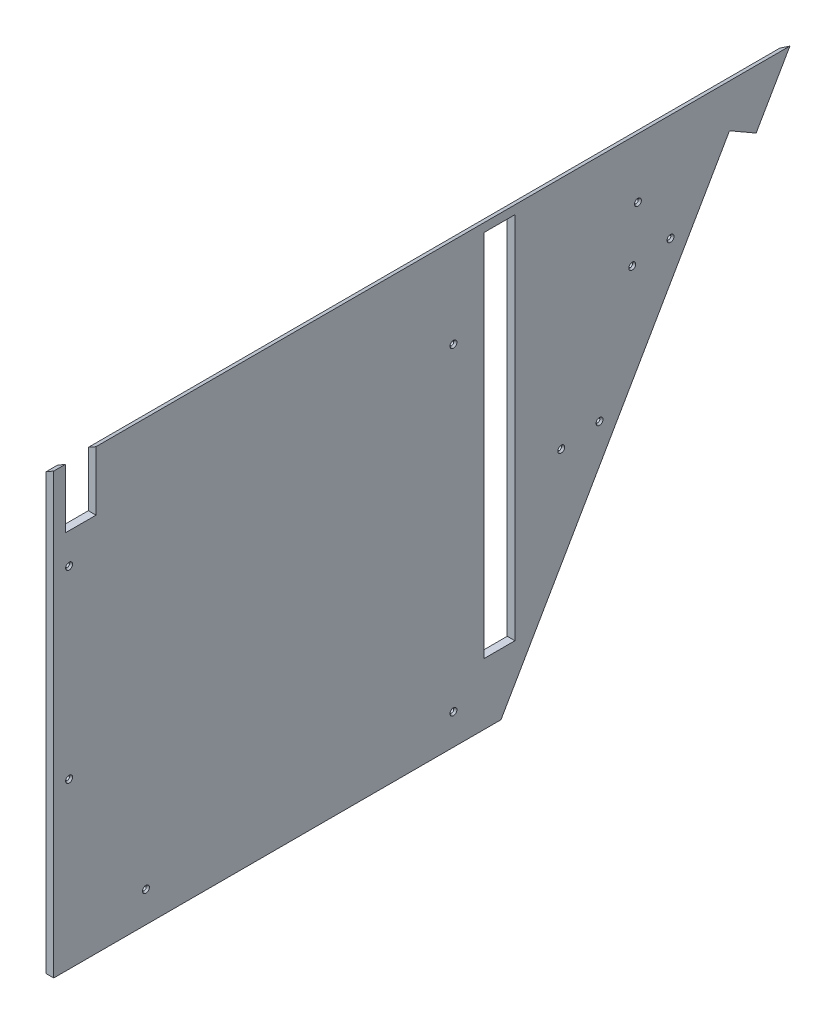
ISO-10303-21;
HEADER;
FILE_DESCRIPTION(('STEP AP214'),'2;1');
FILE_NAME('part.step','',(''),(''),'','','');
FILE_SCHEMA(('AUTOMOTIVE_DESIGN { 1 0 10303 214 1 1 1 1 }'));
ENDSEC;
DATA;
#1=APPLICATION_CONTEXT('core data for automotive mechanical design processes');
#2=APPLICATION_PROTOCOL_DEFINITION('international standard','automotive_design',2000,#1);
#3=PRODUCT_CONTEXT('',#1,'mechanical');
#4=PRODUCT('Part','Part','',(#3));
#5=PRODUCT_RELATED_PRODUCT_CATEGORY('part','',(#4));
#6=PRODUCT_DEFINITION_FORMATION('','',#4);
#7=PRODUCT_DEFINITION_CONTEXT('part definition',#1,'design');
#8=PRODUCT_DEFINITION('design','',#6,#7);
#9=PRODUCT_DEFINITION_SHAPE('','',#8);
#10=(LENGTH_UNIT() NAMED_UNIT(*) SI_UNIT(.MILLI.,.METRE.));
#11=(NAMED_UNIT(*) PLANE_ANGLE_UNIT() SI_UNIT($,.RADIAN.));
#12=(NAMED_UNIT(*) SI_UNIT($,.STERADIAN.) SOLID_ANGLE_UNIT());
#13=UNCERTAINTY_MEASURE_WITH_UNIT(LENGTH_MEASURE(1.E-05),#10,'distance_accuracy_value','');
#14=(GEOMETRIC_REPRESENTATION_CONTEXT(3) GLOBAL_UNCERTAINTY_ASSIGNED_CONTEXT((#13)) GLOBAL_UNIT_ASSIGNED_CONTEXT((#10,
#11,#12)) REPRESENTATION_CONTEXT('',''));
#15=CARTESIAN_POINT('',(0.,0.,0.));
#16=DIRECTION('',(0.,0.,1.));
#17=DIRECTION('',(1.,0.,0.));
#18=AXIS2_PLACEMENT_3D('',#15,#16,#17);
#19=CARTESIAN_POINT('',(10.5585817229401,330.176862243616,122.564235352663));
#20=DIRECTION('',(0.499999999999998,-0.86602540378444,0.));
#21=DIRECTION('',(0.,0.,1.));
#22=AXIS2_PLACEMENT_3D('',#19,#20,#21);
#23=PLANE('',#22);
#24=DIRECTION('',(0.86602540378444,0.499999999999998,0.));
#25=VECTOR('',#24,1.);
#26=CARTESIAN_POINT('',(1.58674999999998,324.996972783253,113.039235352663));
#27=LINE('',#26,#25);
#28=CARTESIAN_POINT('',(6.35,327.74703645297,113.039235352663));
#29=VERTEX_POINT('',#28);
#30=CARTESIAN_POINT('',(0.,324.080862243616,113.039235352663));
#31=VERTEX_POINT('',#30);
#32=EDGE_CURVE('E155',#29,#31,#27,.F.);
#33=ORIENTED_EDGE('',*,*,#32,.T.);
#34=DIRECTION('',(0.,0.,-1.));
#35=VECTOR('',#34,1.);
#36=CARTESIAN_POINT('',(0.,324.080862243616,0.));
#37=LINE('',#36,#35);
#38=CARTESIAN_POINT('',(0.,324.080862243616,122.564235352663));
#39=VERTEX_POINT('',#38);
#40=EDGE_CURVE('E51',#39,#31,#37,.T.);
#41=ORIENTED_EDGE('',*,*,#40,.F.);
#42=DIRECTION('',(0.86602540378444,0.499999999999998,0.));
#43=VECTOR('',#42,1.);
#44=CARTESIAN_POINT('',(10.5585817229401,330.176862243616,122.564235352663));
#45=LINE('',#44,#43);
#46=CARTESIAN_POINT('',(6.35,327.74703645297,122.564235352663));
#47=VERTEX_POINT('',#46);
#48=EDGE_CURVE('E176',#47,#39,#45,.F.);
#49=ORIENTED_EDGE('',*,*,#48,.F.);
#50=DIRECTION('',(0.,0.,-1.));
#51=VECTOR('',#50,1.);
#52=CARTESIAN_POINT('',(6.35,327.74703645297,0.));
#53=LINE('',#52,#51);
#54=EDGE_CURVE('E167',#29,#47,#53,.F.);
#55=ORIENTED_EDGE('',*,*,#54,.F.);
#56=EDGE_LOOP('',(#33,#41,#49,#55));
#57=FACE_BOUND('',#56,.T.);
#58=ADVANCED_FACE('F42',(#57),#23,.F.);
#59=CARTESIAN_POINT('',(6.35,330.176862243616,122.564235352663));
#60=DIRECTION('',(0.,0.,-1.));
#61=DIRECTION('',(0.,1.,0.));
#62=AXIS2_PLACEMENT_3D('',#59,#60,#61);
#63=PLANE('',#62);
#64=DIRECTION('',(0.,-1.,0.));
#65=VECTOR('',#64,1.);
#66=CARTESIAN_POINT('',(6.35,330.176862243616,122.564235352663));
#67=LINE('',#66,#65);
#68=CARTESIAN_POINT('',(6.35,-34.9481377563837,122.564235352663));
#69=VERTEX_POINT('',#68);
#70=EDGE_CURVE('E191',#47,#69,#67,.T.);
#71=ORIENTED_EDGE('',*,*,#70,.F.);
#72=ORIENTED_EDGE('',*,*,#48,.T.);
#73=DIRECTION('',(0.,-1.,0.));
#74=VECTOR('',#73,1.);
#75=CARTESIAN_POINT('',(0.,330.176862243616,122.564235352663));
#76=LINE('',#75,#74);
#77=CARTESIAN_POINT('',(0.,-34.9481377563837,122.564235352663));
#78=VERTEX_POINT('',#77);
#79=EDGE_CURVE('E174',#39,#78,#76,.T.);
#80=ORIENTED_EDGE('',*,*,#79,.T.);
#81=DIRECTION('',(-1.,0.,0.));
#82=VECTOR('',#81,1.);
#83=CARTESIAN_POINT('',(6.35,-34.9481377563837,122.564235352663));
#84=LINE('',#83,#82);
#85=EDGE_CURVE('E183',#69,#78,#84,.T.);
#86=ORIENTED_EDGE('',*,*,#85,.F.);
#87=EDGE_LOOP('',(#71,#72,#80,#86));
#88=FACE_BOUND('',#87,.T.);
#89=ADVANCED_FACE('F390',(#88),#63,.F.);
#90=CARTESIAN_POINT('',(6.35,-34.9481377563837,122.564235352663));
#91=DIRECTION('',(0.,1.,0.));
#92=DIRECTION('',(0.,0.,1.));
#93=AXIS2_PLACEMENT_3D('',#90,#91,#92);
#94=PLANE('',#93);
#95=DIRECTION('',(0.,0.,-1.));
#96=VECTOR('',#95,1.);
#97=CARTESIAN_POINT('',(0.,-34.9481377563837,122.564235352663));
#98=LINE('',#97,#96);
#99=CARTESIAN_POINT('',(0.,-34.9481377563838,-246.901353934639));
#100=VERTEX_POINT('',#99);
#101=EDGE_CURVE('E192',#78,#100,#98,.T.);
#102=ORIENTED_EDGE('',*,*,#101,.T.);
#103=DIRECTION('',(1.,0.,0.));
#104=VECTOR('',#103,1.);
#105=CARTESIAN_POINT('',(0.,-34.9481377563837,-246.90135393464));
#106=LINE('',#105,#104);
#107=CARTESIAN_POINT('',(6.35,-34.9481377563837,-246.90135393464));
#108=VERTEX_POINT('',#107);
#109=EDGE_CURVE('E243',#100,#108,#106,.T.);
#110=ORIENTED_EDGE('',*,*,#109,.T.);
#111=DIRECTION('',(0.,0.,-1.));
#112=VECTOR('',#111,1.);
#113=CARTESIAN_POINT('',(6.35,-34.9481377563837,122.564235352663));
#114=LINE('',#113,#112);
#115=EDGE_CURVE('E200',#69,#108,#114,.T.);
#116=ORIENTED_EDGE('',*,*,#115,.F.);
#117=ORIENTED_EDGE('',*,*,#85,.T.);
#118=EDGE_LOOP('',(#102,#110,#116,#117));
#119=FACE_BOUND('',#118,.T.);
#120=ADVANCED_FACE('F386',(#119),#94,.F.);
#121=CARTESIAN_POINT('',(6.35,330.176862243616,-487.035764647337));
#122=DIRECTION('',(0.,0.500000000000004,0.866025403784436));
#123=DIRECTION('',(0.,-0.866025403784436,0.500000000000004));
#124=AXIS2_PLACEMENT_3D('',#121,#122,#123);
#125=PLANE('',#124);
#126=DIRECTION('',(0.,0.866025403784436,-0.500000000000004));
#127=VECTOR('',#126,1.);
#128=CARTESIAN_POINT('',(0.,330.176862243616,-487.035764647337));
#129=LINE('',#128,#127);
#130=CARTESIAN_POINT('',(0.,279.376862243616,-457.706370972502));
#131=VERTEX_POINT('',#130);
#132=CARTESIAN_POINT('',(0.,324.080862243616,-483.516237406357));
#133=VERTEX_POINT('',#132);
#134=EDGE_CURVE('E187',#131,#133,#129,.T.);
#135=ORIENTED_EDGE('',*,*,#134,.T.);
#136=DIRECTION('',(-0.832050294337844,-0.480384461415259,0.277350098112616));
#137=VECTOR('',#136,1.);
#138=CARTESIAN_POINT('',(-130.118341353984,248.957002836386,-440.143456955029));
#139=LINE('',#138,#137);
#140=CARTESIAN_POINT('',(6.35,327.74703645297,-485.632904073024));
#141=VERTEX_POINT('',#140);
#142=EDGE_CURVE('E11',#133,#141,#139,.F.);
#143=ORIENTED_EDGE('',*,*,#142,.T.);
#144=DIRECTION('',(0.,0.866025403784436,-0.500000000000004));
#145=VECTOR('',#144,1.);
#146=CARTESIAN_POINT('',(6.35,330.176862243616,-487.035764647337));
#147=LINE('',#146,#145);
#148=CARTESIAN_POINT('',(6.35,279.376862243616,-457.706370972502));
#149=VERTEX_POINT('',#148);
#150=EDGE_CURVE('E186',#149,#141,#147,.T.);
#151=ORIENTED_EDGE('',*,*,#150,.F.);
#152=DIRECTION('',(1.,0.,0.));
#153=VECTOR('',#152,1.);
#154=CARTESIAN_POINT('',(0.,279.376862243616,-457.706370972502));
#155=LINE('',#154,#153);
#156=EDGE_CURVE('E227',#131,#149,#155,.T.);
#157=ORIENTED_EDGE('',*,*,#156,.F.);
#158=EDGE_LOOP('',(#135,#143,#151,#157));
#159=FACE_BOUND('',#158,.T.);
#160=ADVANCED_FACE('F378',(#159),#125,.F.);
#161=CARTESIAN_POINT('',(6.35,0.,0.));
#162=DIRECTION('',(1.,0.,0.));
#163=DIRECTION('',(0.,0.,-1.));
#164=AXIS2_PLACEMENT_3D('',#161,#162,#163);
#165=PLANE('',#164);
#166=DIRECTION('',(0.,-1.,0.));
#167=VECTOR('',#166,1.);
#168=CARTESIAN_POINT('',(6.35,327.74703645297,113.039235352663));
#169=LINE('',#168,#167);
#170=CARTESIAN_POINT('',(6.35,278.741862243616,113.039235352663));
#171=VERTEX_POINT('',#170);
#172=EDGE_CURVE('E160',#29,#171,#169,.T.);
#173=ORIENTED_EDGE('',*,*,#172,.F.);
#174=ORIENTED_EDGE('',*,*,#54,.T.);
#175=ORIENTED_EDGE('',*,*,#70,.T.);
#176=ORIENTED_EDGE('',*,*,#115,.T.);
#177=DIRECTION('',(0.,-0.866025403784438,0.5));
#178=VECTOR('',#177,1.);
#179=CARTESIAN_POINT('',(6.35,-34.9481377563837,-246.90135393464));
#180=LINE('',#179,#178);
#181=CARTESIAN_POINT('',(6.35,292.076862243616,-435.709325716377));
#182=VERTEX_POINT('',#181);
#183=EDGE_CURVE('E249',#182,#108,#180,.T.);
#184=ORIENTED_EDGE('',*,*,#183,.F.);
#185=DIRECTION('',(0.,0.5,0.866025403784439));
#186=VECTOR('',#185,1.);
#187=CARTESIAN_POINT('',(6.35,292.076862243616,-435.709325716377));
#188=LINE('',#187,#186);
#189=EDGE_CURVE('E253',#149,#182,#188,.T.);
#190=ORIENTED_EDGE('',*,*,#189,.F.);
#191=ORIENTED_EDGE('',*,*,#150,.T.);
#192=CARTESIAN_POINT('',(6.35,327.74703645297,87.639235352663));
#193=VERTEX_POINT('',#192);
#194=EDGE_CURVE('E179',#141,#193,#53,.F.);
#195=ORIENTED_EDGE('',*,*,#194,.T.);
#196=DIRECTION('',(0.,1.,0.));
#197=VECTOR('',#196,1.);
#198=CARTESIAN_POINT('',(6.35,327.74703645297,87.639235352663));
#199=LINE('',#198,#197);
#200=CARTESIAN_POINT('',(6.35,278.741862243616,87.639235352663));
#201=VERTEX_POINT('',#200);
#202=EDGE_CURVE('E58',#201,#193,#199,.T.);
#203=ORIENTED_EDGE('',*,*,#202,.F.);
#204=DIRECTION('',(0.,0.,-1.));
#205=VECTOR('',#204,1.);
#206=CARTESIAN_POINT('',(6.35,278.741862243616,113.039235352663));
#207=LINE('',#206,#205);
#208=EDGE_CURVE('E362',#171,#201,#207,.T.);
#209=ORIENTED_EDGE('',*,*,#208,.F.);
#210=EDGE_LOOP('',(#173,#174,#175,#176,#184,#190,#191,#195,#203,#209));
#211=FACE_BOUND('',#210,.T.);
#212=CARTESIAN_POINT('',(6.35,235.41803645297,-355.337072672576));
#213=DIRECTION('',(1.,0.,0.));
#214=DIRECTION('',(0.,0.,-1.));
#215=AXIS2_PLACEMENT_3D('',#212,#213,#214);
#216=CIRCLE('',#215,2.85750000000001);
#217=CARTESIAN_POINT('',(6.35,235.41803645297,-358.194572672576));
#218=VERTEX_POINT('',#217);
#219=EDGE_CURVE('E353',#218,#218,#216,.T.);
#220=ORIENTED_EDGE('',*,*,#219,.F.);
#221=EDGE_LOOP('',(#220));
#222=FACE_BOUND('',#221,.T.);
#223=CARTESIAN_POINT('',(6.35,239.434864630588,-386.985583177045));
#224=DIRECTION('',(1.,0.,0.));
#225=DIRECTION('',(0.,0.,-1.));
#226=AXIS2_PLACEMENT_3D('',#223,#224,#225);
#227=CIRCLE('',#226,2.85750000000001);
#228=CARTESIAN_POINT('',(6.35,239.434864630588,-389.843083177045));
#229=VERTEX_POINT('',#228);
#230=EDGE_CURVE('E344',#229,#229,#227,.T.);
#231=ORIENTED_EDGE('',*,*,#230,.F.);
#232=EDGE_LOOP('',(#231));
#233=FACE_BOUND('',#232,.T.);
#234=CARTESIAN_POINT('',(6.35,133.81803645297,-296.67828532291));
#235=DIRECTION('',(1.,0.,0.));
#236=DIRECTION('',(0.,0.,-1.));
#237=AXIS2_PLACEMENT_3D('',#234,#235,#236);
#238=CIRCLE('',#237,2.85750000000001);
#239=CARTESIAN_POINT('',(6.35,133.81803645297,-299.53578532291));
#240=VERTEX_POINT('',#239);
#241=EDGE_CURVE('E335',#240,#240,#238,.T.);
#242=ORIENTED_EDGE('',*,*,#241,.F.);
#243=EDGE_LOOP('',(#242));
#244=FACE_BOUND('',#243,.T.);
#245=CARTESIAN_POINT('',(6.35,137.834864630588,-328.326795827379));
#246=DIRECTION('',(1.,0.,0.));
#247=DIRECTION('',(0.,0.,-1.));
#248=AXIS2_PLACEMENT_3D('',#245,#246,#247);
#249=CIRCLE('',#248,2.85749999999998);
#250=CARTESIAN_POINT('',(6.35,137.834864630588,-331.184295827379));
#251=VERTEX_POINT('',#250);
#252=EDGE_CURVE('E326',#251,#251,#249,.T.);
#253=ORIENTED_EDGE('',*,*,#252,.F.);
#254=EDGE_LOOP('',(#253));
#255=FACE_BOUND('',#254,.T.);
#256=CARTESIAN_POINT('',(6.35,-9.54813775638372,46.364235352663));
#257=DIRECTION('',(1.,0.,0.));
#258=DIRECTION('',(0.,0.,-1.));
#259=AXIS2_PLACEMENT_3D('',#256,#257,#258);
#260=CIRCLE('',#259,2.8575);
#261=CARTESIAN_POINT('',(6.35,-9.54813775638372,43.506735352663));
#262=VERTEX_POINT('',#261);
#263=EDGE_CURVE('E317',#262,#262,#260,.T.);
#264=ORIENTED_EDGE('',*,*,#263,.F.);
#265=EDGE_LOOP('',(#264));
#266=FACE_BOUND('',#265,.T.);
#267=CARTESIAN_POINT('',(6.35,-9.54813775638372,-207.635764647337));
#268=DIRECTION('',(1.,0.,0.));
#269=DIRECTION('',(0.,0.,-1.));
#270=AXIS2_PLACEMENT_3D('',#267,#268,#269);
#271=CIRCLE('',#270,2.8575);
#272=CARTESIAN_POINT('',(6.35,-9.54813775638372,-210.493264647337));
#273=VERTEX_POINT('',#272);
#274=EDGE_CURVE('E308',#273,#273,#271,.T.);
#275=ORIENTED_EDGE('',*,*,#274,.F.);
#276=EDGE_LOOP('',(#275));
#277=FACE_BOUND('',#276,.T.);
#278=CARTESIAN_POINT('',(6.35,100.941862243616,109.864235352663));
#279=DIRECTION('',(1.,0.,0.));
#280=DIRECTION('',(0.,0.,-1.));
#281=AXIS2_PLACEMENT_3D('',#278,#279,#280);
#282=CIRCLE('',#281,2.8575);
#283=CARTESIAN_POINT('',(6.35,100.941862243616,107.006735352663));
#284=VERTEX_POINT('',#283);
#285=EDGE_CURVE('E299',#284,#284,#282,.T.);
#286=ORIENTED_EDGE('',*,*,#285,.F.);
#287=EDGE_LOOP('',(#286));
#288=FACE_BOUND('',#287,.T.);
#289=CARTESIAN_POINT('',(6.35,253.341862243616,109.864235352663));
#290=DIRECTION('',(1.,0.,0.));
#291=DIRECTION('',(0.,0.,-1.));
#292=AXIS2_PLACEMENT_3D('',#289,#290,#291);
#293=CIRCLE('',#292,2.85750000000001);
#294=CARTESIAN_POINT('',(6.35,253.341862243616,107.006735352663));
#295=VERTEX_POINT('',#294);
#296=EDGE_CURVE('E290',#295,#295,#293,.T.);
#297=ORIENTED_EDGE('',*,*,#296,.F.);
#298=EDGE_LOOP('',(#297));
#299=FACE_BOUND('',#298,.T.);
#300=CARTESIAN_POINT('',(6.35,253.341862243616,-207.635764647337));
#301=DIRECTION('',(1.,0.,0.));
#302=DIRECTION('',(0.,0.,-1.));
#303=AXIS2_PLACEMENT_3D('',#300,#301,#302);
#304=CIRCLE('',#303,2.85750000000001);
#305=CARTESIAN_POINT('',(6.35,253.341862243616,-210.493264647337));
#306=VERTEX_POINT('',#305);
#307=EDGE_CURVE('E280',#306,#306,#304,.T.);
#308=ORIENTED_EDGE('',*,*,#307,.F.);
#309=EDGE_LOOP('',(#308));
#310=FACE_BOUND('',#309,.T.);
#311=CARTESIAN_POINT('',(6.35,278.741862243616,-360.035764647337));
#312=DIRECTION('',(1.,0.,0.));
#313=DIRECTION('',(0.,0.,-1.));
#314=AXIS2_PLACEMENT_3D('',#311,#312,#313);
#315=CIRCLE('',#314,2.85750000000001);
#316=CARTESIAN_POINT('',(6.35,278.741862243616,-362.893264647337));
#317=VERTEX_POINT('',#316);
#318=EDGE_CURVE('E269',#317,#317,#315,.T.);
#319=ORIENTED_EDGE('',*,*,#318,.F.);
#320=EDGE_LOOP('',(#319));
#321=FACE_BOUND('',#320,.T.);
#322=DIRECTION('',(0.,-1.,0.));
#323=VECTOR('',#322,1.);
#324=CARTESIAN_POINT('',(6.35,320.651862243616,-233.035764647337));
#325=LINE('',#324,#323);
#326=CARTESIAN_POINT('',(6.35,320.651862243616,-233.035764647337));
#327=VERTEX_POINT('',#326);
#328=CARTESIAN_POINT('',(6.35,15.8518622436163,-233.035764647337));
#329=VERTEX_POINT('',#328);
#330=EDGE_CURVE('E224',#327,#329,#325,.T.);
#331=ORIENTED_EDGE('',*,*,#330,.F.);
#332=DIRECTION('',(0.,0.,1.));
#333=VECTOR('',#332,1.);
#334=CARTESIAN_POINT('',(6.35,320.651862243616,-233.035764647337));
#335=LINE('',#334,#333);
#336=CARTESIAN_POINT('',(6.35,320.651862243616,-258.435764647337));
#337=VERTEX_POINT('',#336);
#338=EDGE_CURVE('E213',#337,#327,#335,.T.);
#339=ORIENTED_EDGE('',*,*,#338,.F.);
#340=DIRECTION('',(0.,1.,0.));
#341=VECTOR('',#340,1.);
#342=CARTESIAN_POINT('',(6.35,320.651862243616,-258.435764647337));
#343=LINE('',#342,#341);
#344=CARTESIAN_POINT('',(6.35,15.8518622436163,-258.435764647337));
#345=VERTEX_POINT('',#344);
#346=EDGE_CURVE('E217',#345,#337,#343,.T.);
#347=ORIENTED_EDGE('',*,*,#346,.F.);
#348=DIRECTION('',(0.,0.,-1.));
#349=VECTOR('',#348,1.);
#350=CARTESIAN_POINT('',(6.35,15.8518622436163,-233.035764647337));
#351=LINE('',#350,#349);
#352=EDGE_CURVE('E221',#329,#345,#351,.T.);
#353=ORIENTED_EDGE('',*,*,#352,.F.);
#354=EDGE_LOOP('',(#331,#339,#347,#353));
#355=FACE_BOUND('',#354,.T.);
#356=ADVANCED_FACE('F370',(#211,#222,#233,#244,#255,#266,#277,#288,#299,#310,#321,#355),#165,.T.);
#357=CARTESIAN_POINT('',(0.,0.,0.));
#358=DIRECTION('',(1.,0.,0.));
#359=DIRECTION('',(0.,0.,-1.));
#360=AXIS2_PLACEMENT_3D('',#357,#358,#359);
#361=PLANE('',#360);
#362=ORIENTED_EDGE('',*,*,#40,.T.);
#363=DIRECTION('',(0.,1.,0.));
#364=VECTOR('',#363,1.);
#365=CARTESIAN_POINT('',(0.,327.74703645297,113.039235352663));
#366=LINE('',#365,#364);
#367=CARTESIAN_POINT('',(0.,278.741862243616,113.039235352663));
#368=VERTEX_POINT('',#367);
#369=EDGE_CURVE('E151',#368,#31,#366,.T.);
#370=ORIENTED_EDGE('',*,*,#369,.F.);
#371=DIRECTION('',(0.,0.,1.));
#372=VECTOR('',#371,1.);
#373=CARTESIAN_POINT('',(0.,278.741862243616,113.039235352663));
#374=LINE('',#373,#372);
#375=CARTESIAN_POINT('',(0.,278.741862243616,87.639235352663));
#376=VERTEX_POINT('',#375);
#377=EDGE_CURVE('E356',#376,#368,#374,.T.);
#378=ORIENTED_EDGE('',*,*,#377,.F.);
#379=DIRECTION('',(0.,-1.,0.));
#380=VECTOR('',#379,1.);
#381=CARTESIAN_POINT('',(0.,327.74703645297,87.639235352663));
#382=LINE('',#381,#380);
#383=CARTESIAN_POINT('',(0.,324.080862243616,87.639235352663));
#384=VERTEX_POINT('',#383);
#385=EDGE_CURVE('E161',#384,#376,#382,.T.);
#386=ORIENTED_EDGE('',*,*,#385,.F.);
#387=EDGE_CURVE('E69',#384,#133,#37,.T.);
#388=ORIENTED_EDGE('',*,*,#387,.T.);
#389=ORIENTED_EDGE('',*,*,#134,.F.);
#390=DIRECTION('',(0.,0.5,0.866025403784439));
#391=VECTOR('',#390,1.);
#392=CARTESIAN_POINT('',(0.,292.076862243616,-435.709325716377));
#393=LINE('',#392,#391);
#394=CARTESIAN_POINT('',(0.,292.076862243616,-435.709325716377));
#395=VERTEX_POINT('',#394);
#396=EDGE_CURVE('E252',#131,#395,#393,.T.);
#397=ORIENTED_EDGE('',*,*,#396,.T.);
#398=DIRECTION('',(0.,-0.866025403784438,0.5));
#399=VECTOR('',#398,1.);
#400=CARTESIAN_POINT('',(0.,-34.9481377563837,-246.90135393464));
#401=LINE('',#400,#399);
#402=EDGE_CURVE('E244',#395,#100,#401,.T.);
#403=ORIENTED_EDGE('',*,*,#402,.T.);
#404=ORIENTED_EDGE('',*,*,#101,.F.);
#405=ORIENTED_EDGE('',*,*,#79,.F.);
#406=EDGE_LOOP('',(#362,#370,#378,#386,#388,#389,#397,#403,#404,#405));
#407=FACE_BOUND('',#406,.T.);
#408=CARTESIAN_POINT('',(0.,235.41803645297,-355.337072672576));
#409=DIRECTION('',(1.,0.,0.));
#410=DIRECTION('',(0.,0.,-1.));
#411=AXIS2_PLACEMENT_3D('',#408,#409,#410);
#412=CIRCLE('',#411,1.63194999999999);
#413=CARTESIAN_POINT('',(0.,235.41803645297,-356.969022672576));
#414=VERTEX_POINT('',#413);
#415=EDGE_CURVE('E347',#414,#414,#412,.T.);
#416=ORIENTED_EDGE('',*,*,#415,.T.);
#417=EDGE_LOOP('',(#416));
#418=FACE_BOUND('',#417,.T.);
#419=CARTESIAN_POINT('',(0.,239.434864630588,-386.985583177045));
#420=DIRECTION('',(1.,0.,0.));
#421=DIRECTION('',(0.,0.,-1.));
#422=AXIS2_PLACEMENT_3D('',#419,#420,#421);
#423=CIRCLE('',#422,1.63194999999999);
#424=CARTESIAN_POINT('',(0.,239.434864630588,-388.617533177045));
#425=VERTEX_POINT('',#424);
#426=EDGE_CURVE('E338',#425,#425,#423,.T.);
#427=ORIENTED_EDGE('',*,*,#426,.T.);
#428=EDGE_LOOP('',(#427));
#429=FACE_BOUND('',#428,.T.);
#430=CARTESIAN_POINT('',(0.,133.81803645297,-296.67828532291));
#431=DIRECTION('',(1.,0.,0.));
#432=DIRECTION('',(0.,0.,-1.));
#433=AXIS2_PLACEMENT_3D('',#430,#431,#432);
#434=CIRCLE('',#433,1.63194999999999);
#435=CARTESIAN_POINT('',(0.,133.81803645297,-298.31023532291));
#436=VERTEX_POINT('',#435);
#437=EDGE_CURVE('E329',#436,#436,#434,.T.);
#438=ORIENTED_EDGE('',*,*,#437,.T.);
#439=EDGE_LOOP('',(#438));
#440=FACE_BOUND('',#439,.T.);
#441=CARTESIAN_POINT('',(0.,137.834864630588,-328.326795827379));
#442=DIRECTION('',(1.,0.,0.));
#443=DIRECTION('',(0.,0.,-1.));
#444=AXIS2_PLACEMENT_3D('',#441,#442,#443);
#445=CIRCLE('',#444,1.63194999999999);
#446=CARTESIAN_POINT('',(0.,137.834864630588,-329.958745827379));
#447=VERTEX_POINT('',#446);
#448=EDGE_CURVE('E320',#447,#447,#445,.T.);
#449=ORIENTED_EDGE('',*,*,#448,.T.);
#450=EDGE_LOOP('',(#449));
#451=FACE_BOUND('',#450,.T.);
#452=CARTESIAN_POINT('',(0.,-9.54813775638372,46.364235352663));
#453=DIRECTION('',(1.,0.,0.));
#454=DIRECTION('',(0.,0.,-1.));
#455=AXIS2_PLACEMENT_3D('',#452,#453,#454);
#456=CIRCLE('',#455,1.63194999999999);
#457=CARTESIAN_POINT('',(0.,-9.54813775638372,44.732285352663));
#458=VERTEX_POINT('',#457);
#459=EDGE_CURVE('E311',#458,#458,#456,.T.);
#460=ORIENTED_EDGE('',*,*,#459,.T.);
#461=EDGE_LOOP('',(#460));
#462=FACE_BOUND('',#461,.T.);
#463=CARTESIAN_POINT('',(0.,-9.54813775638372,-207.635764647337));
#464=DIRECTION('',(1.,0.,0.));
#465=DIRECTION('',(0.,0.,-1.));
#466=AXIS2_PLACEMENT_3D('',#463,#464,#465);
#467=CIRCLE('',#466,1.63194999999999);
#468=CARTESIAN_POINT('',(0.,-9.54813775638372,-209.267714647337));
#469=VERTEX_POINT('',#468);
#470=EDGE_CURVE('E302',#469,#469,#467,.T.);
#471=ORIENTED_EDGE('',*,*,#470,.T.);
#472=EDGE_LOOP('',(#471));
#473=FACE_BOUND('',#472,.T.);
#474=CARTESIAN_POINT('',(0.,100.941862243616,109.864235352663));
#475=DIRECTION('',(1.,0.,0.));
#476=DIRECTION('',(0.,0.,-1.));
#477=AXIS2_PLACEMENT_3D('',#474,#475,#476);
#478=CIRCLE('',#477,1.63194999999999);
#479=CARTESIAN_POINT('',(0.,100.941862243616,108.232285352663));
#480=VERTEX_POINT('',#479);
#481=EDGE_CURVE('E293',#480,#480,#478,.T.);
#482=ORIENTED_EDGE('',*,*,#481,.T.);
#483=EDGE_LOOP('',(#482));
#484=FACE_BOUND('',#483,.T.);
#485=CARTESIAN_POINT('',(0.,253.341862243616,109.864235352663));
#486=DIRECTION('',(1.,0.,0.));
#487=DIRECTION('',(0.,0.,-1.));
#488=AXIS2_PLACEMENT_3D('',#485,#486,#487);
#489=CIRCLE('',#488,1.63194999999999);
#490=CARTESIAN_POINT('',(0.,253.341862243616,108.232285352663));
#491=VERTEX_POINT('',#490);
#492=EDGE_CURVE('E284',#491,#491,#489,.T.);
#493=ORIENTED_EDGE('',*,*,#492,.T.);
#494=EDGE_LOOP('',(#493));
#495=FACE_BOUND('',#494,.T.);
#496=CARTESIAN_POINT('',(0.,253.341862243616,-207.635764647337));
#497=DIRECTION('',(1.,0.,0.));
#498=DIRECTION('',(0.,0.,-1.));
#499=AXIS2_PLACEMENT_3D('',#496,#497,#498);
#500=CIRCLE('',#499,1.63194999999999);
#501=CARTESIAN_POINT('',(0.,253.341862243616,-209.267714647337));
#502=VERTEX_POINT('',#501);
#503=EDGE_CURVE('E272',#502,#502,#500,.T.);
#504=ORIENTED_EDGE('',*,*,#503,.T.);
#505=EDGE_LOOP('',(#504));
#506=FACE_BOUND('',#505,.T.);
#507=CARTESIAN_POINT('',(0.,278.741862243616,-360.035764647337));
#508=DIRECTION('',(1.,0.,0.));
#509=DIRECTION('',(0.,0.,-1.));
#510=AXIS2_PLACEMENT_3D('',#507,#508,#509);
#511=CIRCLE('',#510,1.63194999999999);
#512=CARTESIAN_POINT('',(0.,278.741862243616,-361.667714647337));
#513=VERTEX_POINT('',#512);
#514=EDGE_CURVE('E257',#513,#513,#511,.T.);
#515=ORIENTED_EDGE('',*,*,#514,.T.);
#516=EDGE_LOOP('',(#515));
#517=FACE_BOUND('',#516,.T.);
#518=DIRECTION('',(0.,0.,1.));
#519=VECTOR('',#518,1.);
#520=CARTESIAN_POINT('',(0.,320.651862243616,-233.035764647337));
#521=LINE('',#520,#519);
#522=CARTESIAN_POINT('',(0.,320.651862243616,-258.435764647337));
#523=VERTEX_POINT('',#522);
#524=CARTESIAN_POINT('',(0.,320.651862243616,-233.035764647337));
#525=VERTEX_POINT('',#524);
#526=EDGE_CURVE('E208',#523,#525,#521,.T.);
#527=ORIENTED_EDGE('',*,*,#526,.T.);
#528=DIRECTION('',(0.,-1.,0.));
#529=VECTOR('',#528,1.);
#530=CARTESIAN_POINT('',(0.,320.651862243616,-233.035764647337));
#531=LINE('',#530,#529);
#532=CARTESIAN_POINT('',(0.,15.8518622436163,-233.035764647337));
#533=VERTEX_POINT('',#532);
#534=EDGE_CURVE('E216',#525,#533,#531,.T.);
#535=ORIENTED_EDGE('',*,*,#534,.T.);
#536=DIRECTION('',(0.,0.,-1.));
#537=VECTOR('',#536,1.);
#538=CARTESIAN_POINT('',(0.,15.8518622436163,-233.035764647337));
#539=LINE('',#538,#537);
#540=CARTESIAN_POINT('',(0.,15.8518622436163,-258.435764647337));
#541=VERTEX_POINT('',#540);
#542=EDGE_CURVE('E234',#533,#541,#539,.T.);
#543=ORIENTED_EDGE('',*,*,#542,.T.);
#544=DIRECTION('',(0.,1.,0.));
#545=VECTOR('',#544,1.);
#546=CARTESIAN_POINT('',(0.,320.651862243616,-258.435764647337));
#547=LINE('',#546,#545);
#548=EDGE_CURVE('E230',#541,#523,#547,.T.);
#549=ORIENTED_EDGE('',*,*,#548,.T.);
#550=EDGE_LOOP('',(#527,#535,#543,#549));
#551=FACE_BOUND('',#550,.T.);
#552=ADVANCED_FACE('F171',(#407,#418,#429,#440,#451,#462,#473,#484,#495,#506,#517,#551),#361,.F.);
#553=CARTESIAN_POINT('',(0.,320.651862243616,-233.035764647337));
#554=DIRECTION('',(0.,0.,1.));
#555=DIRECTION('',(0.,-1.,0.));
#556=AXIS2_PLACEMENT_3D('',#553,#554,#555);
#557=PLANE('',#556);
#558=ORIENTED_EDGE('',*,*,#330,.T.);
#559=DIRECTION('',(1.,0.,0.));
#560=VECTOR('',#559,1.);
#561=CARTESIAN_POINT('',(0.,15.8518622436163,-233.035764647337));
#562=LINE('',#561,#560);
#563=EDGE_CURVE('E204',#533,#329,#562,.T.);
#564=ORIENTED_EDGE('',*,*,#563,.F.);
#565=ORIENTED_EDGE('',*,*,#534,.F.);
#566=DIRECTION('',(1.,0.,0.));
#567=VECTOR('',#566,1.);
#568=CARTESIAN_POINT('',(0.,320.651862243616,-233.035764647337));
#569=LINE('',#568,#567);
#570=EDGE_CURVE('E196',#525,#327,#569,.T.);
#571=ORIENTED_EDGE('',*,*,#570,.T.);
#572=EDGE_LOOP('',(#558,#564,#565,#571));
#573=FACE_BOUND('',#572,.T.);
#574=ADVANCED_FACE('F402',(#573),#557,.F.);
#575=CARTESIAN_POINT('',(0.,320.651862243616,-233.035764647337));
#576=DIRECTION('',(0.,1.,0.));
#577=DIRECTION('',(0.,0.,1.));
#578=AXIS2_PLACEMENT_3D('',#575,#576,#577);
#579=PLANE('',#578);
#580=ORIENTED_EDGE('',*,*,#338,.T.);
#581=ORIENTED_EDGE('',*,*,#570,.F.);
#582=ORIENTED_EDGE('',*,*,#526,.F.);
#583=DIRECTION('',(1.,0.,0.));
#584=VECTOR('',#583,1.);
#585=CARTESIAN_POINT('',(0.,320.651862243616,-258.435764647337));
#586=LINE('',#585,#584);
#587=EDGE_CURVE('E210',#523,#337,#586,.T.);
#588=ORIENTED_EDGE('',*,*,#587,.T.);
#589=EDGE_LOOP('',(#580,#581,#582,#588));
#590=FACE_BOUND('',#589,.T.);
#591=ADVANCED_FACE('F407',(#590),#579,.F.);
#592=CARTESIAN_POINT('',(0.,320.651862243616,-258.435764647337));
#593=DIRECTION('',(0.,0.,-1.));
#594=DIRECTION('',(0.,1.,0.));
#595=AXIS2_PLACEMENT_3D('',#592,#593,#594);
#596=PLANE('',#595);
#597=ORIENTED_EDGE('',*,*,#346,.T.);
#598=ORIENTED_EDGE('',*,*,#587,.F.);
#599=ORIENTED_EDGE('',*,*,#548,.F.);
#600=DIRECTION('',(1.,0.,0.));
#601=VECTOR('',#600,1.);
#602=CARTESIAN_POINT('',(0.,15.8518622436163,-258.435764647337));
#603=LINE('',#602,#601);
#604=EDGE_CURVE('E207',#541,#345,#603,.T.);
#605=ORIENTED_EDGE('',*,*,#604,.T.);
#606=EDGE_LOOP('',(#597,#598,#599,#605));
#607=FACE_BOUND('',#606,.T.);
#608=ADVANCED_FACE('F412',(#607),#596,.F.);
#609=CARTESIAN_POINT('',(0.,15.8518622436163,-233.035764647337));
#610=DIRECTION('',(0.,-1.,0.));
#611=DIRECTION('',(0.,0.,-1.));
#612=AXIS2_PLACEMENT_3D('',#609,#610,#611);
#613=PLANE('',#612);
#614=ORIENTED_EDGE('',*,*,#352,.T.);
#615=ORIENTED_EDGE('',*,*,#604,.F.);
#616=ORIENTED_EDGE('',*,*,#542,.F.);
#617=ORIENTED_EDGE('',*,*,#563,.T.);
#618=EDGE_LOOP('',(#614,#615,#616,#617));
#619=FACE_BOUND('',#618,.T.);
#620=ADVANCED_FACE('F409',(#619),#613,.F.);
#621=CARTESIAN_POINT('',(0.,292.076862243616,-435.709325716377));
#622=DIRECTION('',(0.,0.866025403784439,-0.5));
#623=DIRECTION('',(0.,0.5,0.866025403784439));
#624=AXIS2_PLACEMENT_3D('',#621,#622,#623);
#625=PLANE('',#624);
#626=ORIENTED_EDGE('',*,*,#189,.T.);
#627=DIRECTION('',(1.,0.,0.));
#628=VECTOR('',#627,1.);
#629=CARTESIAN_POINT('',(0.,292.076862243616,-435.709325716377));
#630=LINE('',#629,#628);
#631=EDGE_CURVE('E240',#395,#182,#630,.T.);
#632=ORIENTED_EDGE('',*,*,#631,.F.);
#633=ORIENTED_EDGE('',*,*,#396,.F.);
#634=ORIENTED_EDGE('',*,*,#156,.T.);
#635=EDGE_LOOP('',(#626,#632,#633,#634));
#636=FACE_BOUND('',#635,.T.);
#637=ADVANCED_FACE('F381',(#636),#625,.F.);
#638=CARTESIAN_POINT('',(0.,-34.9481377563837,-246.90135393464));
#639=DIRECTION('',(0.,0.5,0.866025403784438));
#640=DIRECTION('',(0.,-0.866025403784439,0.5));
#641=AXIS2_PLACEMENT_3D('',#638,#639,#640);
#642=PLANE('',#641);
#643=ORIENTED_EDGE('',*,*,#183,.T.);
#644=ORIENTED_EDGE('',*,*,#109,.F.);
#645=ORIENTED_EDGE('',*,*,#402,.F.);
#646=ORIENTED_EDGE('',*,*,#631,.T.);
#647=EDGE_LOOP('',(#643,#644,#645,#646));
#648=FACE_BOUND('',#647,.T.);
#649=ADVANCED_FACE('F383',(#648),#642,.F.);
#650=CARTESIAN_POINT('',(6.35,278.741862243616,-360.035764647337));
#651=DIRECTION('',(1.,0.,0.));
#652=DIRECTION('',(0.,0.,-1.));
#653=AXIS2_PLACEMENT_3D('',#650,#651,#652);
#654=CYLINDRICAL_SURFACE('',#653,1.63194999999999);
#655=ORIENTED_EDGE('',*,*,#514,.F.);
#656=EDGE_LOOP('',(#655));
#657=FACE_BOUND('',#656,.T.);
#658=CARTESIAN_POINT('',(4.94016599853029,278.741862243616,-360.035764647337));
#659=DIRECTION('',(1.,0.,0.));
#660=DIRECTION('',(0.,0.,-1.));
#661=AXIS2_PLACEMENT_3D('',#658,#659,#660);
#662=CIRCLE('',#661,1.63194999999999);
#663=CARTESIAN_POINT('',(4.94016599853029,278.741862243616,-361.667714647337));
#664=VERTEX_POINT('',#663);
#665=EDGE_CURVE('E266',#664,#664,#662,.T.);
#666=ORIENTED_EDGE('',*,*,#665,.T.);
#667=EDGE_LOOP('',(#666));
#668=FACE_BOUND('',#667,.T.);
#669=ADVANCED_FACE('F424',(#657,#668),#654,.F.);
#670=CARTESIAN_POINT('',(6.35,278.741862243616,-360.035764647337));
#671=DIRECTION('',(1.,0.,0.));
#672=DIRECTION('',(0.,0.,-1.));
#673=AXIS2_PLACEMENT_3D('',#670,#671,#672);
#674=CONICAL_SURFACE('',#673,2.85750000000001,0.715584993317682);
#675=ORIENTED_EDGE('',*,*,#665,.F.);
#676=EDGE_LOOP('',(#675));
#677=FACE_BOUND('',#676,.T.);
#678=ORIENTED_EDGE('',*,*,#318,.T.);
#679=EDGE_LOOP('',(#678));
#680=FACE_BOUND('',#679,.T.);
#681=ADVANCED_FACE('F427',(#677,#680),#674,.F.);
#682=CARTESIAN_POINT('',(6.35,253.341862243616,-207.635764647337));
#683=DIRECTION('',(1.,0.,0.));
#684=DIRECTION('',(0.,0.,-1.));
#685=AXIS2_PLACEMENT_3D('',#682,#683,#684);
#686=CYLINDRICAL_SURFACE('',#685,1.63194999999999);
#687=ORIENTED_EDGE('',*,*,#503,.F.);
#688=EDGE_LOOP('',(#687));
#689=FACE_BOUND('',#688,.T.);
#690=CARTESIAN_POINT('',(4.94016599853029,253.341862243616,-207.635764647337));
#691=DIRECTION('',(1.,0.,0.));
#692=DIRECTION('',(0.,0.,-1.));
#693=AXIS2_PLACEMENT_3D('',#690,#691,#692);
#694=CIRCLE('',#693,1.63194999999999);
#695=CARTESIAN_POINT('',(4.94016599853029,253.341862243616,-209.267714647337));
#696=VERTEX_POINT('',#695);
#697=EDGE_CURVE('E276',#696,#696,#694,.T.);
#698=ORIENTED_EDGE('',*,*,#697,.T.);
#699=EDGE_LOOP('',(#698));
#700=FACE_BOUND('',#699,.T.);
#701=ADVANCED_FACE('F431',(#689,#700),#686,.F.);
#702=CARTESIAN_POINT('',(6.35,253.341862243616,-207.635764647337));
#703=DIRECTION('',(1.,0.,0.));
#704=DIRECTION('',(0.,0.,-1.));
#705=AXIS2_PLACEMENT_3D('',#702,#703,#704);
#706=CONICAL_SURFACE('',#705,2.85750000000001,0.715584993317682);
#707=ORIENTED_EDGE('',*,*,#697,.F.);
#708=EDGE_LOOP('',(#707));
#709=FACE_BOUND('',#708,.T.);
#710=ORIENTED_EDGE('',*,*,#307,.T.);
#711=EDGE_LOOP('',(#710));
#712=FACE_BOUND('',#711,.T.);
#713=ADVANCED_FACE('F435',(#709,#712),#706,.F.);
#714=CARTESIAN_POINT('',(6.35,253.341862243616,109.864235352663));
#715=DIRECTION('',(1.,0.,0.));
#716=DIRECTION('',(0.,0.,-1.));
#717=AXIS2_PLACEMENT_3D('',#714,#715,#716);
#718=CYLINDRICAL_SURFACE('',#717,1.63194999999999);
#719=ORIENTED_EDGE('',*,*,#492,.F.);
#720=EDGE_LOOP('',(#719));
#721=FACE_BOUND('',#720,.T.);
#722=CARTESIAN_POINT('',(4.94016599853029,253.341862243616,109.864235352663));
#723=DIRECTION('',(1.,0.,0.));
#724=DIRECTION('',(0.,0.,-1.));
#725=AXIS2_PLACEMENT_3D('',#722,#723,#724);
#726=CIRCLE('',#725,1.63194999999999);
#727=CARTESIAN_POINT('',(4.94016599853029,253.341862243616,108.232285352663));
#728=VERTEX_POINT('',#727);
#729=EDGE_CURVE('E287',#728,#728,#726,.T.);
#730=ORIENTED_EDGE('',*,*,#729,.T.);
#731=EDGE_LOOP('',(#730));
#732=FACE_BOUND('',#731,.T.);
#733=ADVANCED_FACE('F439',(#721,#732),#718,.F.);
#734=CARTESIAN_POINT('',(6.35,253.341862243616,109.864235352663));
#735=DIRECTION('',(1.,0.,0.));
#736=DIRECTION('',(0.,0.,-1.));
#737=AXIS2_PLACEMENT_3D('',#734,#735,#736);
#738=CONICAL_SURFACE('',#737,2.85750000000001,0.715584993317682);
#739=ORIENTED_EDGE('',*,*,#729,.F.);
#740=EDGE_LOOP('',(#739));
#741=FACE_BOUND('',#740,.T.);
#742=ORIENTED_EDGE('',*,*,#296,.T.);
#743=EDGE_LOOP('',(#742));
#744=FACE_BOUND('',#743,.T.);
#745=ADVANCED_FACE('F443',(#741,#744),#738,.F.);
#746=CARTESIAN_POINT('',(6.35,100.941862243616,109.864235352663));
#747=DIRECTION('',(1.,0.,0.));
#748=DIRECTION('',(0.,0.,-1.));
#749=AXIS2_PLACEMENT_3D('',#746,#747,#748);
#750=CYLINDRICAL_SURFACE('',#749,1.63194999999999);
#751=ORIENTED_EDGE('',*,*,#481,.F.);
#752=EDGE_LOOP('',(#751));
#753=FACE_BOUND('',#752,.T.);
#754=CARTESIAN_POINT('',(4.94016599853029,100.941862243616,109.864235352663));
#755=DIRECTION('',(1.,0.,0.));
#756=DIRECTION('',(0.,0.,-1.));
#757=AXIS2_PLACEMENT_3D('',#754,#755,#756);
#758=CIRCLE('',#757,1.63194999999999);
#759=CARTESIAN_POINT('',(4.94016599853029,100.941862243616,108.232285352663));
#760=VERTEX_POINT('',#759);
#761=EDGE_CURVE('E296',#760,#760,#758,.T.);
#762=ORIENTED_EDGE('',*,*,#761,.T.);
#763=EDGE_LOOP('',(#762));
#764=FACE_BOUND('',#763,.T.);
#765=ADVANCED_FACE('F447',(#753,#764),#750,.F.);
#766=CARTESIAN_POINT('',(6.35,100.941862243616,109.864235352663));
#767=DIRECTION('',(1.,0.,0.));
#768=DIRECTION('',(0.,0.,-1.));
#769=AXIS2_PLACEMENT_3D('',#766,#767,#768);
#770=CONICAL_SURFACE('',#769,2.8575,0.715584993317676);
#771=ORIENTED_EDGE('',*,*,#761,.F.);
#772=EDGE_LOOP('',(#771));
#773=FACE_BOUND('',#772,.T.);
#774=ORIENTED_EDGE('',*,*,#285,.T.);
#775=EDGE_LOOP('',(#774));
#776=FACE_BOUND('',#775,.T.);
#777=ADVANCED_FACE('F451',(#773,#776),#770,.F.);
#778=CARTESIAN_POINT('',(6.35,-9.54813775638372,-207.635764647337));
#779=DIRECTION('',(1.,0.,0.));
#780=DIRECTION('',(0.,0.,-1.));
#781=AXIS2_PLACEMENT_3D('',#778,#779,#780);
#782=CYLINDRICAL_SURFACE('',#781,1.63194999999999);
#783=ORIENTED_EDGE('',*,*,#470,.F.);
#784=EDGE_LOOP('',(#783));
#785=FACE_BOUND('',#784,.T.);
#786=CARTESIAN_POINT('',(4.94016599853029,-9.54813775638372,-207.635764647337));
#787=DIRECTION('',(1.,0.,0.));
#788=DIRECTION('',(0.,0.,-1.));
#789=AXIS2_PLACEMENT_3D('',#786,#787,#788);
#790=CIRCLE('',#789,1.63195);
#791=CARTESIAN_POINT('',(4.94016599853029,-9.54813775638372,-209.267714647337));
#792=VERTEX_POINT('',#791);
#793=EDGE_CURVE('E305',#792,#792,#790,.T.);
#794=ORIENTED_EDGE('',*,*,#793,.T.);
#795=EDGE_LOOP('',(#794));
#796=FACE_BOUND('',#795,.T.);
#797=ADVANCED_FACE('F455',(#785,#796),#782,.F.);
#798=CARTESIAN_POINT('',(6.35,-9.54813775638372,-207.635764647337));
#799=DIRECTION('',(1.,0.,0.));
#800=DIRECTION('',(0.,0.,-1.));
#801=AXIS2_PLACEMENT_3D('',#798,#799,#800);
#802=CONICAL_SURFACE('',#801,2.8575,0.715584993317675);
#803=ORIENTED_EDGE('',*,*,#793,.F.);
#804=EDGE_LOOP('',(#803));
#805=FACE_BOUND('',#804,.T.);
#806=ORIENTED_EDGE('',*,*,#274,.T.);
#807=EDGE_LOOP('',(#806));
#808=FACE_BOUND('',#807,.T.);
#809=ADVANCED_FACE('F459',(#805,#808),#802,.F.);
#810=CARTESIAN_POINT('',(6.35,-9.54813775638372,46.364235352663));
#811=DIRECTION('',(1.,0.,0.));
#812=DIRECTION('',(0.,0.,-1.));
#813=AXIS2_PLACEMENT_3D('',#810,#811,#812);
#814=CYLINDRICAL_SURFACE('',#813,1.63194999999999);
#815=ORIENTED_EDGE('',*,*,#459,.F.);
#816=EDGE_LOOP('',(#815));
#817=FACE_BOUND('',#816,.T.);
#818=CARTESIAN_POINT('',(4.94016599853029,-9.54813775638372,46.364235352663));
#819=DIRECTION('',(1.,0.,0.));
#820=DIRECTION('',(0.,0.,-1.));
#821=AXIS2_PLACEMENT_3D('',#818,#819,#820);
#822=CIRCLE('',#821,1.63195);
#823=CARTESIAN_POINT('',(4.94016599853029,-9.54813775638372,44.732285352663));
#824=VERTEX_POINT('',#823);
#825=EDGE_CURVE('E314',#824,#824,#822,.T.);
#826=ORIENTED_EDGE('',*,*,#825,.T.);
#827=EDGE_LOOP('',(#826));
#828=FACE_BOUND('',#827,.T.);
#829=ADVANCED_FACE('F463',(#817,#828),#814,.F.);
#830=CARTESIAN_POINT('',(6.35,-9.54813775638372,46.364235352663));
#831=DIRECTION('',(1.,0.,0.));
#832=DIRECTION('',(0.,0.,-1.));
#833=AXIS2_PLACEMENT_3D('',#830,#831,#832);
#834=CONICAL_SURFACE('',#833,2.8575,0.715584993317675);
#835=ORIENTED_EDGE('',*,*,#825,.F.);
#836=EDGE_LOOP('',(#835));
#837=FACE_BOUND('',#836,.T.);
#838=ORIENTED_EDGE('',*,*,#263,.T.);
#839=EDGE_LOOP('',(#838));
#840=FACE_BOUND('',#839,.T.);
#841=ADVANCED_FACE('F467',(#837,#840),#834,.F.);
#842=CARTESIAN_POINT('',(6.35,137.834864630588,-328.326795827379));
#843=DIRECTION('',(1.,0.,0.));
#844=DIRECTION('',(0.,0.,-1.));
#845=AXIS2_PLACEMENT_3D('',#842,#843,#844);
#846=CYLINDRICAL_SURFACE('',#845,1.63194999999999);
#847=ORIENTED_EDGE('',*,*,#448,.F.);
#848=EDGE_LOOP('',(#847));
#849=FACE_BOUND('',#848,.T.);
#850=CARTESIAN_POINT('',(4.94016599853026,137.834864630588,-328.326795827379));
#851=DIRECTION('',(1.,0.,0.));
#852=DIRECTION('',(0.,0.,-1.));
#853=AXIS2_PLACEMENT_3D('',#850,#851,#852);
#854=CIRCLE('',#853,1.63194999999999);
#855=CARTESIAN_POINT('',(4.94016599853026,137.834864630588,-329.958745827379));
#856=VERTEX_POINT('',#855);
#857=EDGE_CURVE('E323',#856,#856,#854,.T.);
#858=ORIENTED_EDGE('',*,*,#857,.T.);
#859=EDGE_LOOP('',(#858));
#860=FACE_BOUND('',#859,.T.);
#861=ADVANCED_FACE('F471',(#849,#860),#846,.F.);
#862=CARTESIAN_POINT('',(6.35,137.834864630588,-328.326795827379));
#863=DIRECTION('',(1.,0.,0.));
#864=DIRECTION('',(0.,0.,-1.));
#865=AXIS2_PLACEMENT_3D('',#862,#863,#864);
#866=CONICAL_SURFACE('',#865,2.85749999999998,0.71558499331766);
#867=ORIENTED_EDGE('',*,*,#857,.F.);
#868=EDGE_LOOP('',(#867));
#869=FACE_BOUND('',#868,.T.);
#870=ORIENTED_EDGE('',*,*,#252,.T.);
#871=EDGE_LOOP('',(#870));
#872=FACE_BOUND('',#871,.T.);
#873=ADVANCED_FACE('F475',(#869,#872),#866,.F.);
#874=CARTESIAN_POINT('',(6.35,133.81803645297,-296.67828532291));
#875=DIRECTION('',(1.,0.,0.));
#876=DIRECTION('',(0.,0.,-1.));
#877=AXIS2_PLACEMENT_3D('',#874,#875,#876);
#878=CYLINDRICAL_SURFACE('',#877,1.63194999999999);
#879=ORIENTED_EDGE('',*,*,#437,.F.);
#880=EDGE_LOOP('',(#879));
#881=FACE_BOUND('',#880,.T.);
#882=CARTESIAN_POINT('',(4.94016599853026,133.81803645297,-296.67828532291));
#883=DIRECTION('',(1.,0.,0.));
#884=DIRECTION('',(0.,0.,-1.));
#885=AXIS2_PLACEMENT_3D('',#882,#883,#884);
#886=CIRCLE('',#885,1.63194999999999);
#887=CARTESIAN_POINT('',(4.94016599853026,133.81803645297,-298.31023532291));
#888=VERTEX_POINT('',#887);
#889=EDGE_CURVE('E332',#888,#888,#886,.T.);
#890=ORIENTED_EDGE('',*,*,#889,.T.);
#891=EDGE_LOOP('',(#890));
#892=FACE_BOUND('',#891,.T.);
#893=ADVANCED_FACE('F479',(#881,#892),#878,.F.);
#894=CARTESIAN_POINT('',(6.35,133.81803645297,-296.67828532291));
#895=DIRECTION('',(1.,0.,0.));
#896=DIRECTION('',(0.,0.,-1.));
#897=AXIS2_PLACEMENT_3D('',#894,#895,#896);
#898=CONICAL_SURFACE('',#897,2.85750000000001,0.715584993317671);
#899=ORIENTED_EDGE('',*,*,#889,.F.);
#900=EDGE_LOOP('',(#899));
#901=FACE_BOUND('',#900,.T.);
#902=ORIENTED_EDGE('',*,*,#241,.T.);
#903=EDGE_LOOP('',(#902));
#904=FACE_BOUND('',#903,.T.);
#905=ADVANCED_FACE('F483',(#901,#904),#898,.F.);
#906=CARTESIAN_POINT('',(6.35,239.434864630588,-386.985583177045));
#907=DIRECTION('',(1.,0.,0.));
#908=DIRECTION('',(0.,0.,-1.));
#909=AXIS2_PLACEMENT_3D('',#906,#907,#908);
#910=CYLINDRICAL_SURFACE('',#909,1.63194999999999);
#911=ORIENTED_EDGE('',*,*,#426,.F.);
#912=EDGE_LOOP('',(#911));
#913=FACE_BOUND('',#912,.T.);
#914=CARTESIAN_POINT('',(4.94016599853026,239.434864630588,-386.985583177045));
#915=DIRECTION('',(1.,0.,0.));
#916=DIRECTION('',(0.,0.,-1.));
#917=AXIS2_PLACEMENT_3D('',#914,#915,#916);
#918=CIRCLE('',#917,1.63194999999999);
#919=CARTESIAN_POINT('',(4.94016599853026,239.434864630588,-388.617533177045));
#920=VERTEX_POINT('',#919);
#921=EDGE_CURVE('E341',#920,#920,#918,.T.);
#922=ORIENTED_EDGE('',*,*,#921,.T.);
#923=EDGE_LOOP('',(#922));
#924=FACE_BOUND('',#923,.T.);
#925=ADVANCED_FACE('F487',(#913,#924),#910,.F.);
#926=CARTESIAN_POINT('',(6.35,239.434864630588,-386.985583177045));
#927=DIRECTION('',(1.,0.,0.));
#928=DIRECTION('',(0.,0.,-1.));
#929=AXIS2_PLACEMENT_3D('',#926,#927,#928);
#930=CONICAL_SURFACE('',#929,2.85750000000001,0.715584993317671);
#931=ORIENTED_EDGE('',*,*,#921,.F.);
#932=EDGE_LOOP('',(#931));
#933=FACE_BOUND('',#932,.T.);
#934=ORIENTED_EDGE('',*,*,#230,.T.);
#935=EDGE_LOOP('',(#934));
#936=FACE_BOUND('',#935,.T.);
#937=ADVANCED_FACE('F491',(#933,#936),#930,.F.);
#938=CARTESIAN_POINT('',(6.35,235.41803645297,-355.337072672576));
#939=DIRECTION('',(1.,0.,0.));
#940=DIRECTION('',(0.,0.,-1.));
#941=AXIS2_PLACEMENT_3D('',#938,#939,#940);
#942=CYLINDRICAL_SURFACE('',#941,1.63194999999999);
#943=ORIENTED_EDGE('',*,*,#415,.F.);
#944=EDGE_LOOP('',(#943));
#945=FACE_BOUND('',#944,.T.);
#946=CARTESIAN_POINT('',(4.94016599853026,235.41803645297,-355.337072672576));
#947=DIRECTION('',(1.,0.,0.));
#948=DIRECTION('',(0.,0.,-1.));
#949=AXIS2_PLACEMENT_3D('',#946,#947,#948);
#950=CIRCLE('',#949,1.63194999999999);
#951=CARTESIAN_POINT('',(4.94016599853026,235.41803645297,-356.969022672576));
#952=VERTEX_POINT('',#951);
#953=EDGE_CURVE('E350',#952,#952,#950,.T.);
#954=ORIENTED_EDGE('',*,*,#953,.T.);
#955=EDGE_LOOP('',(#954));
#956=FACE_BOUND('',#955,.T.);
#957=ADVANCED_FACE('F495',(#945,#956),#942,.F.);
#958=CARTESIAN_POINT('',(6.35,235.41803645297,-355.337072672576));
#959=DIRECTION('',(1.,0.,0.));
#960=DIRECTION('',(0.,0.,-1.));
#961=AXIS2_PLACEMENT_3D('',#958,#959,#960);
#962=CONICAL_SURFACE('',#961,2.85750000000001,0.715584993317671);
#963=ORIENTED_EDGE('',*,*,#953,.F.);
#964=EDGE_LOOP('',(#963));
#965=FACE_BOUND('',#964,.T.);
#966=ORIENTED_EDGE('',*,*,#219,.T.);
#967=EDGE_LOOP('',(#966));
#968=FACE_BOUND('',#967,.T.);
#969=ADVANCED_FACE('F499',(#965,#968),#962,.F.);
#970=DIRECTION('',(-0.86602540378444,-0.499999999999998,0.));
#971=VECTOR('',#970,1.);
#972=CARTESIAN_POINT('',(1.58674999999998,324.996972783253,87.639235352663));
#973=LINE('',#972,#971);
#974=EDGE_CURVE('E168',#384,#193,#973,.F.);
#975=ORIENTED_EDGE('',*,*,#974,.T.);
#976=ORIENTED_EDGE('',*,*,#194,.F.);
#977=ORIENTED_EDGE('',*,*,#142,.F.);
#978=ORIENTED_EDGE('',*,*,#387,.F.);
#979=EDGE_LOOP('',(#975,#976,#977,#978));
#980=FACE_BOUND('',#979,.T.);
#981=ADVANCED_FACE('F44',(#980),#23,.F.);
#982=CARTESIAN_POINT('',(-0.00100000000001575,327.74703645297,113.039235352663));
#983=DIRECTION('',(0.,0.,1.));
#984=DIRECTION('',(1.,0.,0.));
#985=AXIS2_PLACEMENT_3D('',#982,#983,#984);
#986=PLANE('',#985);
#987=ORIENTED_EDGE('',*,*,#369,.T.);
#988=ORIENTED_EDGE('',*,*,#32,.F.);
#989=ORIENTED_EDGE('',*,*,#172,.T.);
#990=DIRECTION('',(1.,0.,0.));
#991=VECTOR('',#990,1.);
#992=CARTESIAN_POINT('',(-0.00100000000001575,278.741862243616,113.039235352663));
#993=LINE('',#992,#991);
#994=EDGE_CURVE('E157',#368,#171,#993,.T.);
#995=ORIENTED_EDGE('',*,*,#994,.F.);
#996=EDGE_LOOP('',(#987,#988,#989,#995));
#997=FACE_BOUND('',#996,.T.);
#998=ADVANCED_FACE('F153',(#997),#986,.F.);
#999=CARTESIAN_POINT('',(-0.00100000000001575,327.74703645297,87.639235352663));
#1000=DIRECTION('',(0.,0.,-1.));
#1001=DIRECTION('',(0.,1.,0.));
#1002=AXIS2_PLACEMENT_3D('',#999,#1000,#1001);
#1003=PLANE('',#1002);
#1004=ORIENTED_EDGE('',*,*,#385,.T.);
#1005=DIRECTION('',(1.,0.,0.));
#1006=VECTOR('',#1005,1.);
#1007=CARTESIAN_POINT('',(-0.00100000000001575,278.741862243616,87.639235352663));
#1008=LINE('',#1007,#1006);
#1009=EDGE_CURVE('E358',#376,#201,#1008,.T.);
#1010=ORIENTED_EDGE('',*,*,#1009,.T.);
#1011=ORIENTED_EDGE('',*,*,#202,.T.);
#1012=ORIENTED_EDGE('',*,*,#974,.F.);
#1013=EDGE_LOOP('',(#1004,#1010,#1011,#1012));
#1014=FACE_BOUND('',#1013,.T.);
#1015=ADVANCED_FACE('F506',(#1014),#1003,.F.);
#1016=CARTESIAN_POINT('',(-0.00100000000001575,278.741862243616,113.039235352663));
#1017=DIRECTION('',(0.,-1.,0.));
#1018=DIRECTION('',(0.,0.,-1.));
#1019=AXIS2_PLACEMENT_3D('',#1016,#1017,#1018);
#1020=PLANE('',#1019);
#1021=ORIENTED_EDGE('',*,*,#377,.T.);
#1022=ORIENTED_EDGE('',*,*,#994,.T.);
#1023=ORIENTED_EDGE('',*,*,#208,.T.);
#1024=ORIENTED_EDGE('',*,*,#1009,.F.);
#1025=EDGE_LOOP('',(#1021,#1022,#1023,#1024));
#1026=FACE_BOUND('',#1025,.T.);
#1027=ADVANCED_FACE('F507',(#1026),#1020,.F.);
#1028=CLOSED_SHELL('',(#58,#89,#120,#160,#356,#552,#574,#591,#608,#620,#637,#649,#669,#681,#701,
#713,#733,#745,#765,#777,#797,#809,#829,#841,#861,#873,#893,#905,#925,#937,#957,#969,#981,#998,
#1015,#1027));
#1029=MANIFOLD_SOLID_BREP('B2',#1028);
#1030=ADVANCED_BREP_SHAPE_REPRESENTATION('',(#18,#1029),#14);
#1031=SHAPE_DEFINITION_REPRESENTATION(#9,#1030);
ENDSEC;
END-ISO-10303-21;
